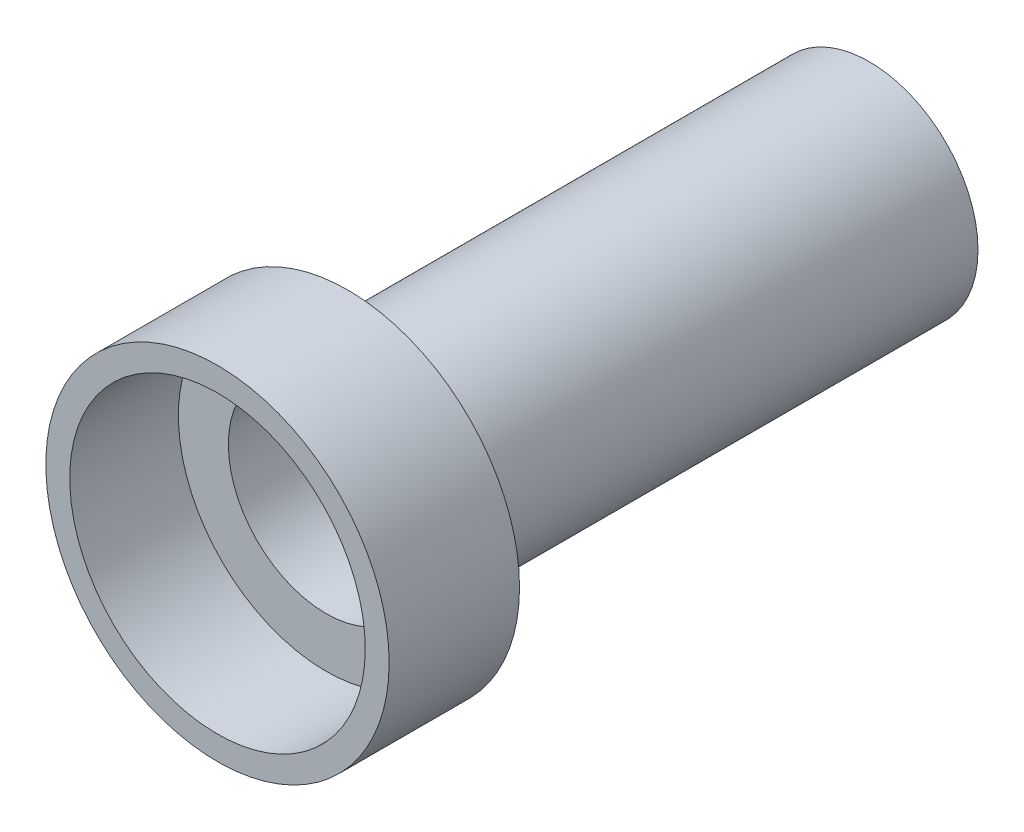
ISO-10303-21;
HEADER;
FILE_DESCRIPTION(('STEP AP214'),'2;1');
FILE_NAME('part.step','',(''),(''),'','','');
FILE_SCHEMA(('AUTOMOTIVE_DESIGN { 1 0 10303 214 1 1 1 1 }'));
ENDSEC;
DATA;
#1=APPLICATION_CONTEXT('core data for automotive mechanical design processes');
#2=APPLICATION_PROTOCOL_DEFINITION('international standard','automotive_design',2000,#1);
#3=PRODUCT_CONTEXT('',#1,'mechanical');
#4=PRODUCT('Part','Part','',(#3));
#5=PRODUCT_RELATED_PRODUCT_CATEGORY('part','',(#4));
#6=PRODUCT_DEFINITION_FORMATION('','',#4);
#7=PRODUCT_DEFINITION_CONTEXT('part definition',#1,'design');
#8=PRODUCT_DEFINITION('design','',#6,#7);
#9=PRODUCT_DEFINITION_SHAPE('','',#8);
#10=(LENGTH_UNIT() NAMED_UNIT(*) SI_UNIT(.MILLI.,.METRE.));
#11=(NAMED_UNIT(*) PLANE_ANGLE_UNIT() SI_UNIT($,.RADIAN.));
#12=(NAMED_UNIT(*) SI_UNIT($,.STERADIAN.) SOLID_ANGLE_UNIT());
#13=UNCERTAINTY_MEASURE_WITH_UNIT(LENGTH_MEASURE(1.E-05),#10,'distance_accuracy_value','');
#14=(GEOMETRIC_REPRESENTATION_CONTEXT(3) GLOBAL_UNCERTAINTY_ASSIGNED_CONTEXT((#13)) GLOBAL_UNIT_ASSIGNED_CONTEXT((#10,
#11,#12)) REPRESENTATION_CONTEXT('',''));
#15=CARTESIAN_POINT('',(0.,0.,0.));
#16=DIRECTION('',(0.,0.,1.));
#17=DIRECTION('',(1.,0.,0.));
#18=AXIS2_PLACEMENT_3D('',#15,#16,#17);
#19=CARTESIAN_POINT('',(0.,0.,1.5));
#20=DIRECTION('',(0.,0.,-1.));
#21=DIRECTION('',(-1.,0.,0.));
#22=AXIS2_PLACEMENT_3D('',#19,#20,#21);
#23=CYLINDRICAL_SURFACE('',#22,1.975);
#24=CARTESIAN_POINT('',(0.,0.,1.5));
#25=DIRECTION('',(0.,0.,1.));
#26=DIRECTION('',(1.,0.,0.));
#27=AXIS2_PLACEMENT_3D('',#24,#25,#26);
#28=CIRCLE('',#27,1.975);
#29=CARTESIAN_POINT('',(1.975,0.,1.5));
#30=VERTEX_POINT('',#29);
#31=EDGE_CURVE('E38',#30,#30,#28,.T.);
#32=ORIENTED_EDGE('',*,*,#31,.F.);
#33=EDGE_LOOP('',(#32));
#34=FACE_BOUND('',#33,.T.);
#35=CARTESIAN_POINT('',(0.,0.,0.));
#36=DIRECTION('',(0.,0.,1.));
#37=DIRECTION('',(1.,0.,0.));
#38=AXIS2_PLACEMENT_3D('',#35,#36,#37);
#39=CIRCLE('',#38,1.975);
#40=CARTESIAN_POINT('',(1.975,0.,0.));
#41=VERTEX_POINT('',#40);
#42=EDGE_CURVE('E43',#41,#41,#39,.T.);
#43=ORIENTED_EDGE('',*,*,#42,.T.);
#44=EDGE_LOOP('',(#43));
#45=FACE_BOUND('',#44,.T.);
#46=ADVANCED_FACE('F31',(#34,#45),#23,.T.);
#47=CARTESIAN_POINT('',(0.,0.,1.5));
#48=DIRECTION('',(0.,0.,1.));
#49=DIRECTION('',(1.,0.,0.));
#50=AXIS2_PLACEMENT_3D('',#47,#48,#49);
#51=PLANE('',#50);
#52=CARTESIAN_POINT('',(0.,0.,1.5));
#53=DIRECTION('',(0.,0.,1.));
#54=DIRECTION('',(1.,0.,0.));
#55=AXIS2_PLACEMENT_3D('',#52,#53,#54);
#56=CIRCLE('',#55,1.7);
#57=CARTESIAN_POINT('',(1.7,0.,1.5));
#58=VERTEX_POINT('',#57);
#59=EDGE_CURVE('E56',#58,#58,#56,.T.);
#60=ORIENTED_EDGE('',*,*,#59,.F.);
#61=EDGE_LOOP('',(#60));
#62=FACE_BOUND('',#61,.T.);
#63=ORIENTED_EDGE('',*,*,#31,.T.);
#64=EDGE_LOOP('',(#63));
#65=FACE_BOUND('',#64,.T.);
#66=ADVANCED_FACE('F84',(#62,#65),#51,.T.);
#67=CARTESIAN_POINT('',(0.,0.,0.));
#68=DIRECTION('',(0.,0.,1.));
#69=DIRECTION('',(1.,0.,0.));
#70=AXIS2_PLACEMENT_3D('',#67,#68,#69);
#71=PLANE('',#70);
#72=CARTESIAN_POINT('',(0.,0.,0.));
#73=DIRECTION('',(0.,0.,-1.));
#74=DIRECTION('',(-1.,0.,0.));
#75=AXIS2_PLACEMENT_3D('',#72,#73,#74);
#76=CIRCLE('',#75,1.25);
#77=CARTESIAN_POINT('',(-1.25,0.,0.));
#78=VERTEX_POINT('',#77);
#79=EDGE_CURVE('E10',#78,#78,#76,.T.);
#80=ORIENTED_EDGE('',*,*,#79,.F.);
#81=EDGE_LOOP('',(#80));
#82=FACE_BOUND('',#81,.T.);
#83=ORIENTED_EDGE('',*,*,#42,.F.);
#84=EDGE_LOOP('',(#83));
#85=FACE_BOUND('',#84,.T.);
#86=ADVANCED_FACE('F89',(#82,#85),#71,.F.);
#87=CARTESIAN_POINT('',(0.,0.,-6.));
#88=DIRECTION('',(0.,0.,1.));
#89=DIRECTION('',(1.,0.,0.));
#90=AXIS2_PLACEMENT_3D('',#87,#88,#89);
#91=CYLINDRICAL_SURFACE('',#90,1.25);
#92=CARTESIAN_POINT('',(0.,0.,-6.));
#93=DIRECTION('',(0.,0.,-1.));
#94=DIRECTION('',(-1.,0.,0.));
#95=AXIS2_PLACEMENT_3D('',#92,#93,#94);
#96=CIRCLE('',#95,1.25);
#97=CARTESIAN_POINT('',(-1.25,0.,-6.));
#98=VERTEX_POINT('',#97);
#99=EDGE_CURVE('E46',#98,#98,#96,.T.);
#100=ORIENTED_EDGE('',*,*,#99,.F.);
#101=EDGE_LOOP('',(#100));
#102=FACE_BOUND('',#101,.T.);
#103=ORIENTED_EDGE('',*,*,#79,.T.);
#104=EDGE_LOOP('',(#103));
#105=FACE_BOUND('',#104,.T.);
#106=ADVANCED_FACE('F97',(#102,#105),#91,.T.);
#107=CARTESIAN_POINT('',(0.,0.,-6.));
#108=DIRECTION('',(0.,0.,-1.));
#109=DIRECTION('',(-1.,0.,0.));
#110=AXIS2_PLACEMENT_3D('',#107,#108,#109);
#111=PLANE('',#110);
#112=CARTESIAN_POINT('',(0.,0.,-6.));
#113=DIRECTION('',(0.,0.,-1.));
#114=DIRECTION('',(-1.,0.,0.));
#115=AXIS2_PLACEMENT_3D('',#112,#113,#114);
#116=CIRCLE('',#115,1.125);
#117=CARTESIAN_POINT('',(-1.125,0.,-6.));
#118=VERTEX_POINT('',#117);
#119=EDGE_CURVE('E62',#118,#118,#116,.T.);
#120=ORIENTED_EDGE('',*,*,#119,.F.);
#121=EDGE_LOOP('',(#120));
#122=FACE_BOUND('',#121,.T.);
#123=ORIENTED_EDGE('',*,*,#99,.T.);
#124=EDGE_LOOP('',(#123));
#125=FACE_BOUND('',#124,.T.);
#126=ADVANCED_FACE('F80',(#122,#125),#111,.T.);
#127=CARTESIAN_POINT('',(0.,0.,0.25));
#128=DIRECTION('',(0.,0.,1.));
#129=DIRECTION('',(1.,0.,0.));
#130=AXIS2_PLACEMENT_3D('',#127,#128,#129);
#131=CYLINDRICAL_SURFACE('',#130,1.7);
#132=CARTESIAN_POINT('',(0.,0.,0.25));
#133=DIRECTION('',(0.,0.,1.));
#134=DIRECTION('',(1.,0.,0.));
#135=AXIS2_PLACEMENT_3D('',#132,#133,#134);
#136=CIRCLE('',#135,1.7);
#137=CARTESIAN_POINT('',(1.7,0.,0.25));
#138=VERTEX_POINT('',#137);
#139=EDGE_CURVE('E52',#138,#138,#136,.T.);
#140=ORIENTED_EDGE('',*,*,#139,.F.);
#141=EDGE_LOOP('',(#140));
#142=FACE_BOUND('',#141,.T.);
#143=ORIENTED_EDGE('',*,*,#59,.T.);
#144=EDGE_LOOP('',(#143));
#145=FACE_BOUND('',#144,.T.);
#146=ADVANCED_FACE('F73',(#142,#145),#131,.F.);
#147=CARTESIAN_POINT('',(0.,0.,0.25));
#148=DIRECTION('',(0.,0.,1.));
#149=DIRECTION('',(1.,0.,0.));
#150=AXIS2_PLACEMENT_3D('',#147,#148,#149);
#151=PLANE('',#150);
#152=CARTESIAN_POINT('',(0.,0.,0.25));
#153=DIRECTION('',(0.,0.,1.));
#154=DIRECTION('',(1.,0.,0.));
#155=AXIS2_PLACEMENT_3D('',#152,#153,#154);
#156=CIRCLE('',#155,1.125);
#157=CARTESIAN_POINT('',(1.125,0.,0.25));
#158=VERTEX_POINT('',#157);
#159=EDGE_CURVE('E34',#158,#158,#156,.T.);
#160=ORIENTED_EDGE('',*,*,#159,.F.);
#161=EDGE_LOOP('',(#160));
#162=FACE_BOUND('',#161,.T.);
#163=ORIENTED_EDGE('',*,*,#139,.T.);
#164=EDGE_LOOP('',(#163));
#165=FACE_BOUND('',#164,.T.);
#166=ADVANCED_FACE('F71',(#162,#165),#151,.T.);
#167=CARTESIAN_POINT('',(0.,0.,45.25));
#168=DIRECTION('',(0.,0.,-1.));
#169=DIRECTION('',(-1.,0.,0.));
#170=AXIS2_PLACEMENT_3D('',#167,#168,#169);
#171=CYLINDRICAL_SURFACE('',#170,1.125);
#172=ORIENTED_EDGE('',*,*,#159,.T.);
#173=EDGE_LOOP('',(#172));
#174=FACE_BOUND('',#173,.T.);
#175=ORIENTED_EDGE('',*,*,#119,.T.);
#176=EDGE_LOOP('',(#175));
#177=FACE_BOUND('',#176,.T.);
#178=ADVANCED_FACE('F69',(#174,#177),#171,.F.);
#179=CLOSED_SHELL('',(#46,#66,#86,#106,#126,#146,#166,#178));
#180=MANIFOLD_SOLID_BREP('B2',#179);
#181=ADVANCED_BREP_SHAPE_REPRESENTATION('',(#18,#180),#14);
#182=SHAPE_DEFINITION_REPRESENTATION(#9,#181);
ENDSEC;
END-ISO-10303-21;
